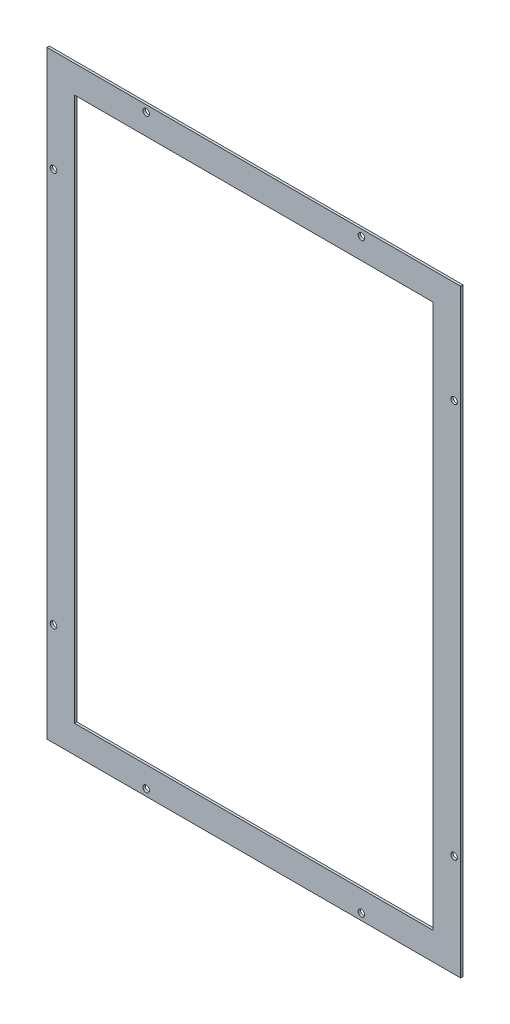
ISO-10303-21;
HEADER;
FILE_DESCRIPTION(('STEP AP214'),'2;1');
FILE_NAME('part.step','',(''),(''),'','','');
FILE_SCHEMA(('AUTOMOTIVE_DESIGN { 1 0 10303 214 1 1 1 1 }'));
ENDSEC;
DATA;
#1=APPLICATION_CONTEXT('core data for automotive mechanical design processes');
#2=APPLICATION_PROTOCOL_DEFINITION('international standard','automotive_design',2000,#1);
#3=PRODUCT_CONTEXT('',#1,'mechanical');
#4=PRODUCT('Part','Part','',(#3));
#5=PRODUCT_RELATED_PRODUCT_CATEGORY('part','',(#4));
#6=PRODUCT_DEFINITION_FORMATION('','',#4);
#7=PRODUCT_DEFINITION_CONTEXT('part definition',#1,'design');
#8=PRODUCT_DEFINITION('design','',#6,#7);
#9=PRODUCT_DEFINITION_SHAPE('','',#8);
#10=(LENGTH_UNIT() NAMED_UNIT(*) SI_UNIT(.MILLI.,.METRE.));
#11=(NAMED_UNIT(*) PLANE_ANGLE_UNIT() SI_UNIT($,.RADIAN.));
#12=(NAMED_UNIT(*) SI_UNIT($,.STERADIAN.) SOLID_ANGLE_UNIT());
#13=UNCERTAINTY_MEASURE_WITH_UNIT(LENGTH_MEASURE(1.E-05),#10,'distance_accuracy_value','');
#14=(GEOMETRIC_REPRESENTATION_CONTEXT(3) GLOBAL_UNCERTAINTY_ASSIGNED_CONTEXT((#13)) GLOBAL_UNIT_ASSIGNED_CONTEXT((#10,
#11,#12)) REPRESENTATION_CONTEXT('',''));
#15=CARTESIAN_POINT('',(0.,0.,0.));
#16=DIRECTION('',(0.,0.,1.));
#17=DIRECTION('',(1.,0.,0.));
#18=AXIS2_PLACEMENT_3D('',#15,#16,#17);
#19=CARTESIAN_POINT('',(-173.,-478.,-2.));
#20=DIRECTION('',(-1.,0.,0.));
#21=DIRECTION('',(0.,0.,1.));
#22=AXIS2_PLACEMENT_3D('',#19,#20,#21);
#23=PLANE('',#22);
#24=DIRECTION('',(0.,-1.,0.));
#25=VECTOR('',#24,1.);
#26=CARTESIAN_POINT('',(-173.,-478.,0.));
#27=LINE('',#26,#25);
#28=CARTESIAN_POINT('',(-173.,23.,0.));
#29=VERTEX_POINT('',#28);
#30=CARTESIAN_POINT('',(-173.,-478.,0.));
#31=VERTEX_POINT('',#30);
#32=EDGE_CURVE('E141',#29,#31,#27,.T.);
#33=ORIENTED_EDGE('',*,*,#32,.F.);
#34=DIRECTION('',(0.,0.,1.));
#35=VECTOR('',#34,1.);
#36=CARTESIAN_POINT('',(-173.,23.,-2.));
#37=LINE('',#36,#35);
#38=CARTESIAN_POINT('',(-173.,23.,-2.));
#39=VERTEX_POINT('',#38);
#40=EDGE_CURVE('E11',#39,#29,#37,.T.);
#41=ORIENTED_EDGE('',*,*,#40,.F.);
#42=DIRECTION('',(0.,-1.,0.));
#43=VECTOR('',#42,1.);
#44=CARTESIAN_POINT('',(-173.,-478.,-2.));
#45=LINE('',#44,#43);
#46=CARTESIAN_POINT('',(-173.,-478.,-2.));
#47=VERTEX_POINT('',#46);
#48=EDGE_CURVE('E145',#39,#47,#45,.T.);
#49=ORIENTED_EDGE('',*,*,#48,.T.);
#50=DIRECTION('',(0.,0.,1.));
#51=VECTOR('',#50,1.);
#52=CARTESIAN_POINT('',(-173.,-478.,-2.));
#53=LINE('',#52,#51);
#54=EDGE_CURVE('E43',#47,#31,#53,.T.);
#55=ORIENTED_EDGE('',*,*,#54,.T.);
#56=EDGE_LOOP('',(#33,#41,#49,#55));
#57=FACE_BOUND('',#56,.T.);
#58=ADVANCED_FACE('F40',(#57),#23,.T.);
#59=CARTESIAN_POINT('',(-173.,23.,-2.));
#60=DIRECTION('',(0.,1.,0.));
#61=DIRECTION('',(-1.,0.,0.));
#62=AXIS2_PLACEMENT_3D('',#59,#60,#61);
#63=PLANE('',#62);
#64=DIRECTION('',(-1.,0.,0.));
#65=VECTOR('',#64,1.);
#66=CARTESIAN_POINT('',(-173.,23.,0.));
#67=LINE('',#66,#65);
#68=CARTESIAN_POINT('',(173.,23.,0.));
#69=VERTEX_POINT('',#68);
#70=EDGE_CURVE('E149',#69,#29,#67,.T.);
#71=ORIENTED_EDGE('',*,*,#70,.F.);
#72=DIRECTION('',(0.,0.,1.));
#73=VECTOR('',#72,1.);
#74=CARTESIAN_POINT('',(173.,23.,-2.));
#75=LINE('',#74,#73);
#76=CARTESIAN_POINT('',(173.,23.,-2.));
#77=VERTEX_POINT('',#76);
#78=EDGE_CURVE('E48',#77,#69,#75,.T.);
#79=ORIENTED_EDGE('',*,*,#78,.F.);
#80=DIRECTION('',(-1.,0.,0.));
#81=VECTOR('',#80,1.);
#82=CARTESIAN_POINT('',(-173.,23.,-2.));
#83=LINE('',#82,#81);
#84=EDGE_CURVE('E155',#77,#39,#83,.T.);
#85=ORIENTED_EDGE('',*,*,#84,.T.);
#86=ORIENTED_EDGE('',*,*,#40,.T.);
#87=EDGE_LOOP('',(#71,#79,#85,#86));
#88=FACE_BOUND('',#87,.T.);
#89=ADVANCED_FACE('F181',(#88),#63,.T.);
#90=CARTESIAN_POINT('',(173.,-478.,-2.));
#91=DIRECTION('',(1.,0.,0.));
#92=DIRECTION('',(0.,1.,0.));
#93=AXIS2_PLACEMENT_3D('',#90,#91,#92);
#94=PLANE('',#93);
#95=DIRECTION('',(0.,1.,0.));
#96=VECTOR('',#95,1.);
#97=CARTESIAN_POINT('',(173.,-478.,0.));
#98=LINE('',#97,#96);
#99=CARTESIAN_POINT('',(173.,-478.,0.));
#100=VERTEX_POINT('',#99);
#101=EDGE_CURVE('E163',#100,#69,#98,.T.);
#102=ORIENTED_EDGE('',*,*,#101,.F.);
#103=DIRECTION('',(0.,0.,1.));
#104=VECTOR('',#103,1.);
#105=CARTESIAN_POINT('',(173.,-478.,-2.));
#106=LINE('',#105,#104);
#107=CARTESIAN_POINT('',(173.,-478.,-2.));
#108=VERTEX_POINT('',#107);
#109=EDGE_CURVE('E168',#108,#100,#106,.T.);
#110=ORIENTED_EDGE('',*,*,#109,.F.);
#111=DIRECTION('',(0.,1.,0.));
#112=VECTOR('',#111,1.);
#113=CARTESIAN_POINT('',(173.,-478.,-2.));
#114=LINE('',#113,#112);
#115=EDGE_CURVE('E152',#108,#77,#114,.T.);
#116=ORIENTED_EDGE('',*,*,#115,.T.);
#117=ORIENTED_EDGE('',*,*,#78,.T.);
#118=EDGE_LOOP('',(#102,#110,#116,#117));
#119=FACE_BOUND('',#118,.T.);
#120=ADVANCED_FACE('F185',(#119),#94,.T.);
#121=CARTESIAN_POINT('',(-173.,-478.,-2.));
#122=DIRECTION('',(0.,-1.,0.));
#123=DIRECTION('',(0.,0.,-1.));
#124=AXIS2_PLACEMENT_3D('',#121,#122,#123);
#125=PLANE('',#124);
#126=DIRECTION('',(1.,0.,0.));
#127=VECTOR('',#126,1.);
#128=CARTESIAN_POINT('',(-173.,-478.,0.));
#129=LINE('',#128,#127);
#130=EDGE_CURVE('E160',#31,#100,#129,.T.);
#131=ORIENTED_EDGE('',*,*,#130,.F.);
#132=ORIENTED_EDGE('',*,*,#54,.F.);
#133=DIRECTION('',(1.,0.,0.));
#134=VECTOR('',#133,1.);
#135=CARTESIAN_POINT('',(-173.,-478.,-2.));
#136=LINE('',#135,#134);
#137=EDGE_CURVE('E148',#47,#108,#136,.T.);
#138=ORIENTED_EDGE('',*,*,#137,.T.);
#139=ORIENTED_EDGE('',*,*,#109,.T.);
#140=EDGE_LOOP('',(#131,#132,#138,#139));
#141=FACE_BOUND('',#140,.T.);
#142=ADVANCED_FACE('F176',(#141),#125,.T.);
#143=CARTESIAN_POINT('',(0.,0.,-2.));
#144=DIRECTION('',(0.,0.,-1.));
#145=DIRECTION('',(-1.,0.,0.));
#146=AXIS2_PLACEMENT_3D('',#143,#144,#145);
#147=PLANE('',#146);
#148=CARTESIAN_POINT('',(-89.9999999999975,17.5000000000006,-2.));
#149=DIRECTION('',(0.,0.,-1.));
#150=DIRECTION('',(-1.,0.,0.));
#151=AXIS2_PLACEMENT_3D('',#148,#149,#150);
#152=CIRCLE('',#151,2.75000000000001);
#153=CARTESIAN_POINT('',(-92.7499999999975,17.5000000000006,-2.));
#154=VERTEX_POINT('',#153);
#155=EDGE_CURVE('E129',#154,#154,#152,.T.);
#156=ORIENTED_EDGE('',*,*,#155,.F.);
#157=EDGE_LOOP('',(#156));
#158=FACE_BOUND('',#157,.T.);
#159=CARTESIAN_POINT('',(-167.499999999999,-62.4999999999997,-2.));
#160=DIRECTION('',(0.,0.,-1.));
#161=DIRECTION('',(-1.,0.,0.));
#162=AXIS2_PLACEMENT_3D('',#159,#160,#161);
#163=CIRCLE('',#162,2.75000000000001);
#164=CARTESIAN_POINT('',(-170.249999999999,-62.4999999999997,-2.));
#165=VERTEX_POINT('',#164);
#166=EDGE_CURVE('E426',#165,#165,#163,.T.);
#167=ORIENTED_EDGE('',*,*,#166,.F.);
#168=EDGE_LOOP('',(#167));
#169=FACE_BOUND('',#168,.T.);
#170=CARTESIAN_POINT('',(-167.499999999999,-392.5,-2.));
#171=DIRECTION('',(0.,0.,-1.));
#172=DIRECTION('',(-1.,0.,0.));
#173=AXIS2_PLACEMENT_3D('',#170,#171,#172);
#174=CIRCLE('',#173,2.75000000000001);
#175=CARTESIAN_POINT('',(-170.249999999999,-392.5,-2.));
#176=VERTEX_POINT('',#175);
#177=EDGE_CURVE('E424',#176,#176,#174,.T.);
#178=ORIENTED_EDGE('',*,*,#177,.F.);
#179=EDGE_LOOP('',(#178));
#180=FACE_BOUND('',#179,.T.);
#181=CARTESIAN_POINT('',(167.499999999999,-392.5,-2.));
#182=DIRECTION('',(0.,0.,-1.));
#183=DIRECTION('',(-1.,0.,0.));
#184=AXIS2_PLACEMENT_3D('',#181,#182,#183);
#185=CIRCLE('',#184,2.75000000000001);
#186=CARTESIAN_POINT('',(164.749999999999,-392.5,-2.));
#187=VERTEX_POINT('',#186);
#188=EDGE_CURVE('E421',#187,#187,#185,.T.);
#189=ORIENTED_EDGE('',*,*,#188,.F.);
#190=EDGE_LOOP('',(#189));
#191=FACE_BOUND('',#190,.T.);
#192=CARTESIAN_POINT('',(167.499999999999,-62.4999999999997,-2.));
#193=DIRECTION('',(0.,0.,-1.));
#194=DIRECTION('',(-1.,0.,0.));
#195=AXIS2_PLACEMENT_3D('',#192,#193,#194);
#196=CIRCLE('',#195,2.75000000000001);
#197=CARTESIAN_POINT('',(164.749999999999,-62.4999999999997,-2.));
#198=VERTEX_POINT('',#197);
#199=EDGE_CURVE('E418',#198,#198,#196,.T.);
#200=ORIENTED_EDGE('',*,*,#199,.F.);
#201=EDGE_LOOP('',(#200));
#202=FACE_BOUND('',#201,.T.);
#203=CARTESIAN_POINT('',(90.0000000000025,-472.5,-2.));
#204=DIRECTION('',(0.,0.,-1.));
#205=DIRECTION('',(-1.,0.,0.));
#206=AXIS2_PLACEMENT_3D('',#203,#204,#205);
#207=CIRCLE('',#206,2.75000000000001);
#208=CARTESIAN_POINT('',(87.2500000000025,-472.5,-2.));
#209=VERTEX_POINT('',#208);
#210=EDGE_CURVE('E415',#209,#209,#207,.T.);
#211=ORIENTED_EDGE('',*,*,#210,.F.);
#212=EDGE_LOOP('',(#211));
#213=FACE_BOUND('',#212,.T.);
#214=CARTESIAN_POINT('',(-89.9999999999975,-472.500000000001,-2.));
#215=DIRECTION('',(0.,0.,-1.));
#216=DIRECTION('',(-1.,0.,0.));
#217=AXIS2_PLACEMENT_3D('',#214,#215,#216);
#218=CIRCLE('',#217,2.75000000000001);
#219=CARTESIAN_POINT('',(-92.7499999999975,-472.500000000001,-2.));
#220=VERTEX_POINT('',#219);
#221=EDGE_CURVE('E412',#220,#220,#218,.T.);
#222=ORIENTED_EDGE('',*,*,#221,.F.);
#223=EDGE_LOOP('',(#222));
#224=FACE_BOUND('',#223,.T.);
#225=CARTESIAN_POINT('',(90.0000000000025,17.5,-2.));
#226=DIRECTION('',(0.,0.,-1.));
#227=DIRECTION('',(-1.,0.,0.));
#228=AXIS2_PLACEMENT_3D('',#225,#226,#227);
#229=CIRCLE('',#228,2.75000000000001);
#230=CARTESIAN_POINT('',(87.2500000000025,17.5,-2.));
#231=VERTEX_POINT('',#230);
#232=EDGE_CURVE('E395',#231,#231,#229,.T.);
#233=ORIENTED_EDGE('',*,*,#232,.F.);
#234=EDGE_LOOP('',(#233));
#235=FACE_BOUND('',#234,.T.);
#236=DIRECTION('',(0.,-1.,0.));
#237=VECTOR('',#236,1.);
#238=CARTESIAN_POINT('',(-150.,-455.,-2.));
#239=LINE('',#238,#237);
#240=CARTESIAN_POINT('',(-150.,0.,-2.));
#241=VERTEX_POINT('',#240);
#242=CARTESIAN_POINT('',(-150.,-455.,-2.));
#243=VERTEX_POINT('',#242);
#244=EDGE_CURVE('E107',#241,#243,#239,.T.);
#245=ORIENTED_EDGE('',*,*,#244,.T.);
#246=DIRECTION('',(1.,0.,0.));
#247=VECTOR('',#246,1.);
#248=CARTESIAN_POINT('',(-150.,-455.,-2.));
#249=LINE('',#248,#247);
#250=CARTESIAN_POINT('',(150.,-455.,-2.));
#251=VERTEX_POINT('',#250);
#252=EDGE_CURVE('E116',#243,#251,#249,.T.);
#253=ORIENTED_EDGE('',*,*,#252,.T.);
#254=DIRECTION('',(0.,1.,0.));
#255=VECTOR('',#254,1.);
#256=CARTESIAN_POINT('',(150.,-455.,-2.));
#257=LINE('',#256,#255);
#258=CARTESIAN_POINT('',(150.,0.,-2.));
#259=VERTEX_POINT('',#258);
#260=EDGE_CURVE('E56',#251,#259,#257,.T.);
#261=ORIENTED_EDGE('',*,*,#260,.T.);
#262=DIRECTION('',(-1.,0.,0.));
#263=VECTOR('',#262,1.);
#264=CARTESIAN_POINT('',(-150.,0.,-2.));
#265=LINE('',#264,#263);
#266=EDGE_CURVE('E113',#259,#241,#265,.T.);
#267=ORIENTED_EDGE('',*,*,#266,.T.);
#268=EDGE_LOOP('',(#245,#253,#261,#267));
#269=FACE_BOUND('',#268,.T.);
#270=ORIENTED_EDGE('',*,*,#48,.F.);
#271=ORIENTED_EDGE('',*,*,#84,.F.);
#272=ORIENTED_EDGE('',*,*,#115,.F.);
#273=ORIENTED_EDGE('',*,*,#137,.F.);
#274=EDGE_LOOP('',(#270,#271,#272,#273));
#275=FACE_BOUND('',#274,.T.);
#276=ADVANCED_FACE('F120',(#158,#169,#180,#191,#202,#213,#224,#235,#269,#275),#147,.T.);
#277=CARTESIAN_POINT('',(0.,0.,0.));
#278=DIRECTION('',(0.,0.,-1.));
#279=DIRECTION('',(-1.,0.,0.));
#280=AXIS2_PLACEMENT_3D('',#277,#278,#279);
#281=PLANE('',#280);
#282=CARTESIAN_POINT('',(-89.9999999999975,17.5000000000006,0.));
#283=DIRECTION('',(0.,0.,1.));
#284=DIRECTION('',(1.,0.,0.));
#285=AXIS2_PLACEMENT_3D('',#282,#283,#284);
#286=CIRCLE('',#285,2.75000000000001);
#287=CARTESIAN_POINT('',(-87.2499999999975,17.5000000000006,0.));
#288=VERTEX_POINT('',#287);
#289=EDGE_CURVE('E390',#288,#288,#286,.T.);
#290=ORIENTED_EDGE('',*,*,#289,.F.);
#291=EDGE_LOOP('',(#290));
#292=FACE_BOUND('',#291,.T.);
#293=CARTESIAN_POINT('',(-167.499999999999,-62.4999999999997,0.));
#294=DIRECTION('',(0.,0.,1.));
#295=DIRECTION('',(1.,0.,0.));
#296=AXIS2_PLACEMENT_3D('',#293,#294,#295);
#297=CIRCLE('',#296,2.75000000000001);
#298=CARTESIAN_POINT('',(-164.749999999999,-62.4999999999997,0.));
#299=VERTEX_POINT('',#298);
#300=EDGE_CURVE('E392',#299,#299,#297,.T.);
#301=ORIENTED_EDGE('',*,*,#300,.F.);
#302=EDGE_LOOP('',(#301));
#303=FACE_BOUND('',#302,.T.);
#304=CARTESIAN_POINT('',(-167.499999999999,-392.5,0.));
#305=DIRECTION('',(0.,0.,1.));
#306=DIRECTION('',(1.,0.,0.));
#307=AXIS2_PLACEMENT_3D('',#304,#305,#306);
#308=CIRCLE('',#307,2.75000000000001);
#309=CARTESIAN_POINT('',(-164.749999999999,-392.5,0.));
#310=VERTEX_POINT('',#309);
#311=EDGE_CURVE('E398',#310,#310,#308,.T.);
#312=ORIENTED_EDGE('',*,*,#311,.F.);
#313=EDGE_LOOP('',(#312));
#314=FACE_BOUND('',#313,.T.);
#315=CARTESIAN_POINT('',(167.499999999999,-392.5,0.));
#316=DIRECTION('',(0.,0.,1.));
#317=DIRECTION('',(-1.,0.,0.));
#318=AXIS2_PLACEMENT_3D('',#315,#316,#317);
#319=CIRCLE('',#318,2.75000000000001);
#320=CARTESIAN_POINT('',(164.749999999999,-392.5,0.));
#321=VERTEX_POINT('',#320);
#322=EDGE_CURVE('E406',#321,#321,#319,.T.);
#323=ORIENTED_EDGE('',*,*,#322,.F.);
#324=EDGE_LOOP('',(#323));
#325=FACE_BOUND('',#324,.T.);
#326=CARTESIAN_POINT('',(167.499999999999,-62.4999999999997,0.));
#327=DIRECTION('',(0.,0.,1.));
#328=DIRECTION('',(-1.,0.,0.));
#329=AXIS2_PLACEMENT_3D('',#326,#327,#328);
#330=CIRCLE('',#329,2.75000000000001);
#331=CARTESIAN_POINT('',(164.749999999999,-62.4999999999997,0.));
#332=VERTEX_POINT('',#331);
#333=EDGE_CURVE('E408',#332,#332,#330,.T.);
#334=ORIENTED_EDGE('',*,*,#333,.F.);
#335=EDGE_LOOP('',(#334));
#336=FACE_BOUND('',#335,.T.);
#337=CARTESIAN_POINT('',(90.0000000000025,-472.5,0.));
#338=DIRECTION('',(0.,0.,1.));
#339=DIRECTION('',(-1.,0.,0.));
#340=AXIS2_PLACEMENT_3D('',#337,#338,#339);
#341=CIRCLE('',#340,2.75000000000001);
#342=CARTESIAN_POINT('',(87.2500000000025,-472.5,0.));
#343=VERTEX_POINT('',#342);
#344=EDGE_CURVE('E453',#343,#343,#341,.T.);
#345=ORIENTED_EDGE('',*,*,#344,.F.);
#346=EDGE_LOOP('',(#345));
#347=FACE_BOUND('',#346,.T.);
#348=CARTESIAN_POINT('',(-89.9999999999975,-472.500000000001,0.));
#349=DIRECTION('',(0.,0.,1.));
#350=DIRECTION('',(-1.,0.,0.));
#351=AXIS2_PLACEMENT_3D('',#348,#349,#350);
#352=CIRCLE('',#351,2.75000000000001);
#353=CARTESIAN_POINT('',(-92.7499999999975,-472.500000000001,0.));
#354=VERTEX_POINT('',#353);
#355=EDGE_CURVE('E401',#354,#354,#352,.T.);
#356=ORIENTED_EDGE('',*,*,#355,.F.);
#357=EDGE_LOOP('',(#356));
#358=FACE_BOUND('',#357,.T.);
#359=CARTESIAN_POINT('',(90.0000000000025,17.5,0.));
#360=DIRECTION('',(0.,0.,1.));
#361=DIRECTION('',(1.,0.,0.));
#362=AXIS2_PLACEMENT_3D('',#359,#360,#361);
#363=CIRCLE('',#362,2.75000000000001);
#364=CARTESIAN_POINT('',(92.7500000000025,17.5,0.));
#365=VERTEX_POINT('',#364);
#366=EDGE_CURVE('E391',#365,#365,#363,.T.);
#367=ORIENTED_EDGE('',*,*,#366,.F.);
#368=EDGE_LOOP('',(#367));
#369=FACE_BOUND('',#368,.T.);
#370=DIRECTION('',(1.,0.,0.));
#371=VECTOR('',#370,1.);
#372=CARTESIAN_POINT('',(-150.,-455.,0.));
#373=LINE('',#372,#371);
#374=CARTESIAN_POINT('',(-150.,-455.,0.));
#375=VERTEX_POINT('',#374);
#376=CARTESIAN_POINT('',(150.,-455.,0.));
#377=VERTEX_POINT('',#376);
#378=EDGE_CURVE('E135',#375,#377,#373,.T.);
#379=ORIENTED_EDGE('',*,*,#378,.F.);
#380=DIRECTION('',(0.,-1.,0.));
#381=VECTOR('',#380,1.);
#382=CARTESIAN_POINT('',(-150.,-455.,0.));
#383=LINE('',#382,#381);
#384=CARTESIAN_POINT('',(-150.,0.,0.));
#385=VERTEX_POINT('',#384);
#386=EDGE_CURVE('E64',#385,#375,#383,.T.);
#387=ORIENTED_EDGE('',*,*,#386,.F.);
#388=DIRECTION('',(-1.,0.,0.));
#389=VECTOR('',#388,1.);
#390=CARTESIAN_POINT('',(-150.,0.,0.));
#391=LINE('',#390,#389);
#392=CARTESIAN_POINT('',(150.,0.,0.));
#393=VERTEX_POINT('',#392);
#394=EDGE_CURVE('E123',#393,#385,#391,.T.);
#395=ORIENTED_EDGE('',*,*,#394,.F.);
#396=DIRECTION('',(0.,1.,0.));
#397=VECTOR('',#396,1.);
#398=CARTESIAN_POINT('',(150.,-455.,0.));
#399=LINE('',#398,#397);
#400=EDGE_CURVE('E126',#377,#393,#399,.T.);
#401=ORIENTED_EDGE('',*,*,#400,.F.);
#402=EDGE_LOOP('',(#379,#387,#395,#401));
#403=FACE_BOUND('',#402,.T.);
#404=ORIENTED_EDGE('',*,*,#32,.T.);
#405=ORIENTED_EDGE('',*,*,#130,.T.);
#406=ORIENTED_EDGE('',*,*,#101,.T.);
#407=ORIENTED_EDGE('',*,*,#70,.T.);
#408=EDGE_LOOP('',(#404,#405,#406,#407));
#409=FACE_BOUND('',#408,.T.);
#410=ADVANCED_FACE('F178',(#292,#303,#314,#325,#336,#347,#358,#369,#403,#409),#281,.F.);
#411=CARTESIAN_POINT('',(-150.,-455.,-2.));
#412=DIRECTION('',(-1.,0.,0.));
#413=DIRECTION('',(0.,0.,1.));
#414=AXIS2_PLACEMENT_3D('',#411,#412,#413);
#415=PLANE('',#414);
#416=ORIENTED_EDGE('',*,*,#386,.T.);
#417=DIRECTION('',(0.,0.,1.));
#418=VECTOR('',#417,1.);
#419=CARTESIAN_POINT('',(-150.,-455.,-2.));
#420=LINE('',#419,#418);
#421=EDGE_CURVE('E103',#243,#375,#420,.T.);
#422=ORIENTED_EDGE('',*,*,#421,.F.);
#423=ORIENTED_EDGE('',*,*,#244,.F.);
#424=DIRECTION('',(0.,0.,1.));
#425=VECTOR('',#424,1.);
#426=CARTESIAN_POINT('',(-150.,0.,-2.));
#427=LINE('',#426,#425);
#428=EDGE_CURVE('E139',#241,#385,#427,.T.);
#429=ORIENTED_EDGE('',*,*,#428,.T.);
#430=EDGE_LOOP('',(#416,#422,#423,#429));
#431=FACE_BOUND('',#430,.T.);
#432=ADVANCED_FACE('F105',(#431),#415,.F.);
#433=CARTESIAN_POINT('',(-150.,0.,-2.));
#434=DIRECTION('',(0.,1.,0.));
#435=DIRECTION('',(0.,0.,1.));
#436=AXIS2_PLACEMENT_3D('',#433,#434,#435);
#437=PLANE('',#436);
#438=ORIENTED_EDGE('',*,*,#394,.T.);
#439=ORIENTED_EDGE('',*,*,#428,.F.);
#440=ORIENTED_EDGE('',*,*,#266,.F.);
#441=DIRECTION('',(0.,0.,1.));
#442=VECTOR('',#441,1.);
#443=CARTESIAN_POINT('',(150.,0.,-2.));
#444=LINE('',#443,#442);
#445=EDGE_CURVE('E142',#259,#393,#444,.T.);
#446=ORIENTED_EDGE('',*,*,#445,.T.);
#447=EDGE_LOOP('',(#438,#439,#440,#446));
#448=FACE_BOUND('',#447,.T.);
#449=ADVANCED_FACE('F224',(#448),#437,.F.);
#450=CARTESIAN_POINT('',(150.,-455.,-2.));
#451=DIRECTION('',(1.,0.,0.));
#452=DIRECTION('',(0.,0.,-1.));
#453=AXIS2_PLACEMENT_3D('',#450,#451,#452);
#454=PLANE('',#453);
#455=ORIENTED_EDGE('',*,*,#400,.T.);
#456=ORIENTED_EDGE('',*,*,#445,.F.);
#457=ORIENTED_EDGE('',*,*,#260,.F.);
#458=DIRECTION('',(0.,0.,1.));
#459=VECTOR('',#458,1.);
#460=CARTESIAN_POINT('',(150.,-455.,-2.));
#461=LINE('',#460,#459);
#462=EDGE_CURVE('E112',#251,#377,#461,.T.);
#463=ORIENTED_EDGE('',*,*,#462,.T.);
#464=EDGE_LOOP('',(#455,#456,#457,#463));
#465=FACE_BOUND('',#464,.T.);
#466=ADVANCED_FACE('F236',(#465),#454,.F.);
#467=CARTESIAN_POINT('',(-150.,-455.,-2.));
#468=DIRECTION('',(0.,-1.,0.));
#469=DIRECTION('',(1.,0.,0.));
#470=AXIS2_PLACEMENT_3D('',#467,#468,#469);
#471=PLANE('',#470);
#472=ORIENTED_EDGE('',*,*,#378,.T.);
#473=ORIENTED_EDGE('',*,*,#462,.F.);
#474=ORIENTED_EDGE('',*,*,#252,.F.);
#475=ORIENTED_EDGE('',*,*,#421,.T.);
#476=EDGE_LOOP('',(#472,#473,#474,#475));
#477=FACE_BOUND('',#476,.T.);
#478=ADVANCED_FACE('F117',(#477),#471,.F.);
#479=CARTESIAN_POINT('',(90.0000000000025,17.5,-10.));
#480=DIRECTION('',(0.,0.,1.));
#481=DIRECTION('',(1.,0.,0.));
#482=AXIS2_PLACEMENT_3D('',#479,#480,#481);
#483=CYLINDRICAL_SURFACE('',#482,2.75000000000001);
#484=ORIENTED_EDGE('',*,*,#232,.T.);
#485=EDGE_LOOP('',(#484));
#486=FACE_BOUND('',#485,.T.);
#487=ORIENTED_EDGE('',*,*,#366,.T.);
#488=EDGE_LOOP('',(#487));
#489=FACE_BOUND('',#488,.T.);
#490=ADVANCED_FACE('F256',(#486,#489),#483,.F.);
#491=CARTESIAN_POINT('',(-89.9999999999975,-472.500000000001,-10.));
#492=DIRECTION('',(0.,0.,1.));
#493=DIRECTION('',(1.,0.,0.));
#494=AXIS2_PLACEMENT_3D('',#491,#492,#493);
#495=CYLINDRICAL_SURFACE('',#494,2.75000000000001);
#496=ORIENTED_EDGE('',*,*,#221,.T.);
#497=EDGE_LOOP('',(#496));
#498=FACE_BOUND('',#497,.T.);
#499=ORIENTED_EDGE('',*,*,#355,.T.);
#500=EDGE_LOOP('',(#499));
#501=FACE_BOUND('',#500,.T.);
#502=ADVANCED_FACE('F276',(#498,#501),#495,.F.);
#503=CARTESIAN_POINT('',(90.0000000000025,-472.5,-10.));
#504=DIRECTION('',(0.,0.,1.));
#505=DIRECTION('',(1.,0.,0.));
#506=AXIS2_PLACEMENT_3D('',#503,#504,#505);
#507=CYLINDRICAL_SURFACE('',#506,2.75000000000001);
#508=ORIENTED_EDGE('',*,*,#210,.T.);
#509=EDGE_LOOP('',(#508));
#510=FACE_BOUND('',#509,.T.);
#511=ORIENTED_EDGE('',*,*,#344,.T.);
#512=EDGE_LOOP('',(#511));
#513=FACE_BOUND('',#512,.T.);
#514=ADVANCED_FACE('F287',(#510,#513),#507,.F.);
#515=CARTESIAN_POINT('',(167.499999999999,-62.4999999999997,-10.));
#516=DIRECTION('',(0.,0.,1.));
#517=DIRECTION('',(1.,0.,0.));
#518=AXIS2_PLACEMENT_3D('',#515,#516,#517);
#519=CYLINDRICAL_SURFACE('',#518,2.75000000000001);
#520=ORIENTED_EDGE('',*,*,#199,.T.);
#521=EDGE_LOOP('',(#520));
#522=FACE_BOUND('',#521,.T.);
#523=ORIENTED_EDGE('',*,*,#333,.T.);
#524=EDGE_LOOP('',(#523));
#525=FACE_BOUND('',#524,.T.);
#526=ADVANCED_FACE('F298',(#522,#525),#519,.F.);
#527=CARTESIAN_POINT('',(167.499999999999,-392.5,-10.));
#528=DIRECTION('',(0.,0.,1.));
#529=DIRECTION('',(1.,0.,0.));
#530=AXIS2_PLACEMENT_3D('',#527,#528,#529);
#531=CYLINDRICAL_SURFACE('',#530,2.75000000000001);
#532=ORIENTED_EDGE('',*,*,#188,.T.);
#533=EDGE_LOOP('',(#532));
#534=FACE_BOUND('',#533,.T.);
#535=ORIENTED_EDGE('',*,*,#322,.T.);
#536=EDGE_LOOP('',(#535));
#537=FACE_BOUND('',#536,.T.);
#538=ADVANCED_FACE('F309',(#534,#537),#531,.F.);
#539=CARTESIAN_POINT('',(-167.499999999999,-392.5,-10.));
#540=DIRECTION('',(0.,0.,1.));
#541=DIRECTION('',(1.,0.,0.));
#542=AXIS2_PLACEMENT_3D('',#539,#540,#541);
#543=CYLINDRICAL_SURFACE('',#542,2.75000000000001);
#544=ORIENTED_EDGE('',*,*,#177,.T.);
#545=EDGE_LOOP('',(#544));
#546=FACE_BOUND('',#545,.T.);
#547=ORIENTED_EDGE('',*,*,#311,.T.);
#548=EDGE_LOOP('',(#547));
#549=FACE_BOUND('',#548,.T.);
#550=ADVANCED_FACE('F320',(#546,#549),#543,.F.);
#551=CARTESIAN_POINT('',(-167.499999999999,-62.4999999999997,-10.));
#552=DIRECTION('',(0.,0.,1.));
#553=DIRECTION('',(1.,0.,0.));
#554=AXIS2_PLACEMENT_3D('',#551,#552,#553);
#555=CYLINDRICAL_SURFACE('',#554,2.75000000000001);
#556=ORIENTED_EDGE('',*,*,#166,.T.);
#557=EDGE_LOOP('',(#556));
#558=FACE_BOUND('',#557,.T.);
#559=ORIENTED_EDGE('',*,*,#300,.T.);
#560=EDGE_LOOP('',(#559));
#561=FACE_BOUND('',#560,.T.);
#562=ADVANCED_FACE('F331',(#558,#561),#555,.F.);
#563=CARTESIAN_POINT('',(-89.9999999999975,17.5000000000006,-10.));
#564=DIRECTION('',(0.,0.,1.));
#565=DIRECTION('',(1.,0.,0.));
#566=AXIS2_PLACEMENT_3D('',#563,#564,#565);
#567=CYLINDRICAL_SURFACE('',#566,2.75000000000001);
#568=ORIENTED_EDGE('',*,*,#155,.T.);
#569=EDGE_LOOP('',(#568));
#570=FACE_BOUND('',#569,.T.);
#571=ORIENTED_EDGE('',*,*,#289,.T.);
#572=EDGE_LOOP('',(#571));
#573=FACE_BOUND('',#572,.T.);
#574=ADVANCED_FACE('F342',(#570,#573),#567,.F.);
#575=CLOSED_SHELL('',(#58,#89,#120,#142,#276,#410,#432,#449,#466,#478,#490,#502,#514,#526,#538,
#550,#562,#574));
#576=MANIFOLD_SOLID_BREP('B2',#575);
#577=ADVANCED_BREP_SHAPE_REPRESENTATION('',(#18,#576),#14);
#578=SHAPE_DEFINITION_REPRESENTATION(#9,#577);
ENDSEC;
END-ISO-10303-21;
